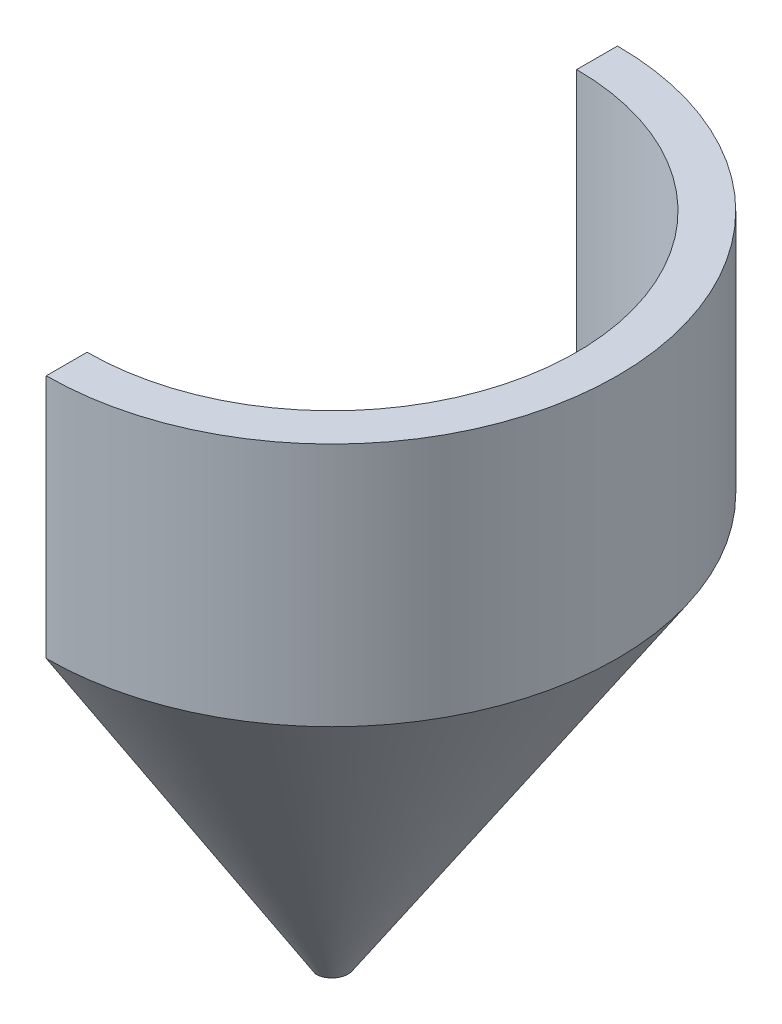
ISO-10303-21;
HEADER;
FILE_DESCRIPTION(('STEP AP214'),'2;1');
FILE_NAME('part.step','',(''),(''),'','','');
FILE_SCHEMA(('AUTOMOTIVE_DESIGN { 1 0 10303 214 1 1 1 1 }'));
ENDSEC;
DATA;
#1=APPLICATION_CONTEXT('core data for automotive mechanical design processes');
#2=APPLICATION_PROTOCOL_DEFINITION('international standard','automotive_design',2000,#1);
#3=PRODUCT_CONTEXT('',#1,'mechanical');
#4=PRODUCT('Part','Part','',(#3));
#5=PRODUCT_RELATED_PRODUCT_CATEGORY('part','',(#4));
#6=PRODUCT_DEFINITION_FORMATION('','',#4);
#7=PRODUCT_DEFINITION_CONTEXT('part definition',#1,'design');
#8=PRODUCT_DEFINITION('design','',#6,#7);
#9=PRODUCT_DEFINITION_SHAPE('','',#8);
#10=(LENGTH_UNIT() NAMED_UNIT(*) SI_UNIT(.MILLI.,.METRE.));
#11=(NAMED_UNIT(*) PLANE_ANGLE_UNIT() SI_UNIT($,.RADIAN.));
#12=(NAMED_UNIT(*) SI_UNIT($,.STERADIAN.) SOLID_ANGLE_UNIT());
#13=UNCERTAINTY_MEASURE_WITH_UNIT(LENGTH_MEASURE(1.E-05),#10,'distance_accuracy_value','');
#14=(GEOMETRIC_REPRESENTATION_CONTEXT(3) GLOBAL_UNCERTAINTY_ASSIGNED_CONTEXT((#13)) GLOBAL_UNIT_ASSIGNED_CONTEXT((#10,
#11,#12)) REPRESENTATION_CONTEXT('',''));
#15=CARTESIAN_POINT('',(0.,0.,0.));
#16=DIRECTION('',(0.,0.,1.));
#17=DIRECTION('',(1.,0.,0.));
#18=AXIS2_PLACEMENT_3D('',#15,#16,#17);
#19=CARTESIAN_POINT('',(0.,0.,0.));
#20=DIRECTION('',(1.,0.,0.));
#21=DIRECTION('',(0.,0.,-1.));
#22=AXIS2_PLACEMENT_3D('',#19,#20,#21);
#23=PLANE('',#22);
#24=DIRECTION('',(0.,-1.,0.));
#25=VECTOR('',#24,1.);
#26=CARTESIAN_POINT('',(0.,30.,-30.));
#27=LINE('',#26,#25);
#28=CARTESIAN_POINT('',(0.,0.,-30.));
#29=VERTEX_POINT('',#28);
#30=CARTESIAN_POINT('',(0.,30.,-30.));
#31=VERTEX_POINT('',#30);
#32=EDGE_CURVE('E11',#29,#31,#27,.F.);
#33=ORIENTED_EDGE('',*,*,#32,.T.);
#34=DIRECTION('',(0.,0.,-1.));
#35=VECTOR('',#34,1.);
#36=CARTESIAN_POINT('',(0.,30.,0.));
#37=LINE('',#36,#35);
#38=CARTESIAN_POINT('',(0.,30.,-35.));
#39=VERTEX_POINT('',#38);
#40=EDGE_CURVE('E65',#31,#39,#37,.T.);
#41=ORIENTED_EDGE('',*,*,#40,.T.);
#42=DIRECTION('',(0.,-1.,0.));
#43=VECTOR('',#42,1.);
#44=CARTESIAN_POINT('',(0.,30.,-35.));
#45=LINE('',#44,#43);
#46=CARTESIAN_POINT('',(0.,0.,-35.));
#47=VERTEX_POINT('',#46);
#48=EDGE_CURVE('E107',#47,#39,#45,.F.);
#49=ORIENTED_EDGE('',*,*,#48,.F.);
#50=DIRECTION('',(0.,0.834609406561725,-0.550842208330739));
#51=VECTOR('',#50,1.);
#52=CARTESIAN_POINT('',(0.,-53.030303030303,0.));
#53=LINE('',#52,#51);
#54=CARTESIAN_POINT('',(0.,-50.,-2.));
#55=VERTEX_POINT('',#54);
#56=EDGE_CURVE('E116',#55,#47,#53,.T.);
#57=ORIENTED_EDGE('',*,*,#56,.F.);
#58=DIRECTION('',(0.,0.,-1.));
#59=VECTOR('',#58,1.);
#60=CARTESIAN_POINT('',(0.,-50.,0.));
#61=LINE('',#60,#59);
#62=CARTESIAN_POINT('',(0.,-50.,2.));
#63=VERTEX_POINT('',#62);
#64=EDGE_CURVE('E112',#63,#55,#61,.T.);
#65=ORIENTED_EDGE('',*,*,#64,.F.);
#66=DIRECTION('',(0.,-0.834609406561725,-0.550842208330739));
#67=VECTOR('',#66,1.);
#68=CARTESIAN_POINT('',(0.,-53.030303030303,0.));
#69=LINE('',#68,#67);
#70=CARTESIAN_POINT('',(0.,0.,35.));
#71=VERTEX_POINT('',#70);
#72=EDGE_CURVE('E110',#71,#63,#69,.T.);
#73=ORIENTED_EDGE('',*,*,#72,.F.);
#74=DIRECTION('',(0.,-1.,0.));
#75=VECTOR('',#74,1.);
#76=CARTESIAN_POINT('',(0.,30.,35.));
#77=LINE('',#76,#75);
#78=CARTESIAN_POINT('',(0.,30.,35.));
#79=VERTEX_POINT('',#78);
#80=EDGE_CURVE('E99',#79,#71,#77,.T.);
#81=ORIENTED_EDGE('',*,*,#80,.F.);
#82=CARTESIAN_POINT('',(0.,30.,30.));
#83=VERTEX_POINT('',#82);
#84=EDGE_CURVE('E106',#79,#83,#37,.T.);
#85=ORIENTED_EDGE('',*,*,#84,.T.);
#86=DIRECTION('',(0.,-1.,0.));
#87=VECTOR('',#86,1.);
#88=CARTESIAN_POINT('',(0.,30.,30.));
#89=LINE('',#88,#87);
#90=CARTESIAN_POINT('',(0.,0.,30.));
#91=VERTEX_POINT('',#90);
#92=EDGE_CURVE('E51',#83,#91,#89,.T.);
#93=ORIENTED_EDGE('',*,*,#92,.T.);
#94=DIRECTION('',(0.,-0.849056603773585,-0.528301886792453));
#95=VECTOR('',#94,1.);
#96=CARTESIAN_POINT('',(0.,-48.2142857142857,0.));
#97=LINE('',#96,#95);
#98=CARTESIAN_POINT('',(0.,-45.,2.));
#99=VERTEX_POINT('',#98);
#100=EDGE_CURVE('E134',#99,#91,#97,.F.);
#101=ORIENTED_EDGE('',*,*,#100,.F.);
#102=DIRECTION('',(0.,0.,1.));
#103=VECTOR('',#102,1.);
#104=CARTESIAN_POINT('',(0.,-45.,0.));
#105=LINE('',#104,#103);
#106=CARTESIAN_POINT('',(0.,-45.,-2.));
#107=VERTEX_POINT('',#106);
#108=EDGE_CURVE('E139',#107,#99,#105,.T.);
#109=ORIENTED_EDGE('',*,*,#108,.F.);
#110=DIRECTION('',(0.,0.849056603773585,-0.528301886792453));
#111=VECTOR('',#110,1.);
#112=CARTESIAN_POINT('',(0.,-48.2142857142857,0.));
#113=LINE('',#112,#111);
#114=EDGE_CURVE('E46',#29,#107,#113,.F.);
#115=ORIENTED_EDGE('',*,*,#114,.F.);
#116=EDGE_LOOP('',(#33,#41,#49,#57,#65,#73,#81,#85,#93,#101,#109,#115));
#117=FACE_BOUND('',#116,.T.);
#118=ADVANCED_FACE('F43',(#117),#23,.F.);
#119=CARTESIAN_POINT('',(0.,30.,0.));
#120=DIRECTION('',(0.,1.,0.));
#121=DIRECTION('',(0.,0.,1.));
#122=AXIS2_PLACEMENT_3D('',#119,#120,#121);
#123=PLANE('',#122);
#124=ORIENTED_EDGE('',*,*,#84,.F.);
#125=CARTESIAN_POINT('',(0.,30.,0.));
#126=DIRECTION('',(0.,1.,0.));
#127=DIRECTION('',(0.,0.,1.));
#128=AXIS2_PLACEMENT_3D('',#125,#126,#127);
#129=CIRCLE('',#128,35.);
#130=EDGE_CURVE('E104',#79,#39,#129,.T.);
#131=ORIENTED_EDGE('',*,*,#130,.T.);
#132=ORIENTED_EDGE('',*,*,#40,.F.);
#133=CARTESIAN_POINT('',(0.,30.,0.));
#134=DIRECTION('',(0.,1.,0.));
#135=DIRECTION('',(0.,0.,1.));
#136=AXIS2_PLACEMENT_3D('',#133,#134,#135);
#137=CIRCLE('',#136,30.);
#138=EDGE_CURVE('E128',#83,#31,#137,.T.);
#139=ORIENTED_EDGE('',*,*,#138,.F.);
#140=EDGE_LOOP('',(#124,#131,#132,#139));
#141=FACE_BOUND('',#140,.T.);
#142=ADVANCED_FACE('F151',(#141),#123,.T.);
#143=CARTESIAN_POINT('',(0.,-45.,0.));
#144=DIRECTION('',(0.,-1.,0.));
#145=DIRECTION('',(1.,0.,0.));
#146=AXIS2_PLACEMENT_3D('',#143,#144,#145);
#147=PLANE('',#146);
#148=CARTESIAN_POINT('',(0.,-45.,0.));
#149=DIRECTION('',(0.,1.,0.));
#150=DIRECTION('',(-1.,0.,0.));
#151=AXIS2_PLACEMENT_3D('',#148,#149,#150);
#152=CIRCLE('',#151,2.);
#153=EDGE_CURVE('E120',#99,#107,#152,.T.);
#154=ORIENTED_EDGE('',*,*,#153,.T.);
#155=ORIENTED_EDGE('',*,*,#108,.T.);
#156=EDGE_LOOP('',(#154,#155));
#157=FACE_BOUND('',#156,.T.);
#158=ADVANCED_FACE('F148',(#157),#147,.F.);
#159=CARTESIAN_POINT('',(0.,30.,0.));
#160=DIRECTION('',(0.,-1.,0.));
#161=DIRECTION('',(0.,0.,-1.));
#162=AXIS2_PLACEMENT_3D('',#159,#160,#161);
#163=CYLINDRICAL_SURFACE('',#162,30.);
#164=ORIENTED_EDGE('',*,*,#92,.F.);
#165=ORIENTED_EDGE('',*,*,#138,.T.);
#166=ORIENTED_EDGE('',*,*,#32,.F.);
#167=CARTESIAN_POINT('',(0.,0.,0.));
#168=DIRECTION('',(0.,1.,0.));
#169=DIRECTION('',(0.,0.,1.));
#170=AXIS2_PLACEMENT_3D('',#167,#168,#169);
#171=CIRCLE('',#170,30.);
#172=EDGE_CURVE('E124',#91,#29,#171,.T.);
#173=ORIENTED_EDGE('',*,*,#172,.F.);
#174=EDGE_LOOP('',(#164,#165,#166,#173));
#175=FACE_BOUND('',#174,.T.);
#176=ADVANCED_FACE('F150',(#175),#163,.F.);
#177=CARTESIAN_POINT('',(0.,0.,0.));
#178=DIRECTION('',(0.,1.,0.));
#179=DIRECTION('',(-1.,0.,0.));
#180=AXIS2_PLACEMENT_3D('',#177,#178,#179);
#181=CONICAL_SURFACE('',#180,30.,0.556599318010223);
#182=ORIENTED_EDGE('',*,*,#172,.T.);
#183=ORIENTED_EDGE('',*,*,#114,.T.);
#184=ORIENTED_EDGE('',*,*,#153,.F.);
#185=ORIENTED_EDGE('',*,*,#100,.T.);
#186=EDGE_LOOP('',(#182,#183,#184,#185));
#187=FACE_BOUND('',#186,.T.);
#188=ADVANCED_FACE('F146',(#187),#181,.F.);
#189=CARTESIAN_POINT('',(0.,30.,0.));
#190=DIRECTION('',(0.,-1.,0.));
#191=DIRECTION('',(0.,0.,-1.));
#192=AXIS2_PLACEMENT_3D('',#189,#190,#191);
#193=CYLINDRICAL_SURFACE('',#192,35.);
#194=ORIENTED_EDGE('',*,*,#130,.F.);
#195=ORIENTED_EDGE('',*,*,#80,.T.);
#196=CARTESIAN_POINT('',(0.,0.,0.));
#197=DIRECTION('',(0.,1.,0.));
#198=DIRECTION('',(-1.,0.,0.));
#199=AXIS2_PLACEMENT_3D('',#196,#197,#198);
#200=CIRCLE('',#199,35.);
#201=EDGE_CURVE('E103',#71,#47,#200,.T.);
#202=ORIENTED_EDGE('',*,*,#201,.T.);
#203=ORIENTED_EDGE('',*,*,#48,.T.);
#204=EDGE_LOOP('',(#194,#195,#202,#203));
#205=FACE_BOUND('',#204,.T.);
#206=ADVANCED_FACE('F101',(#205),#193,.T.);
#207=CARTESIAN_POINT('',(2.00000000000001,-50.,0.));
#208=DIRECTION('',(0.,1.,0.));
#209=DIRECTION('',(-1.,0.,0.));
#210=AXIS2_PLACEMENT_3D('',#207,#208,#209);
#211=PLANE('',#210);
#212=CARTESIAN_POINT('',(0.,-50.,0.));
#213=DIRECTION('',(0.,1.,0.));
#214=DIRECTION('',(-1.,0.,0.));
#215=AXIS2_PLACEMENT_3D('',#212,#213,#214);
#216=CIRCLE('',#215,2.);
#217=EDGE_CURVE('E121',#63,#55,#216,.T.);
#218=ORIENTED_EDGE('',*,*,#217,.F.);
#219=ORIENTED_EDGE('',*,*,#64,.T.);
#220=EDGE_LOOP('',(#218,#219));
#221=FACE_BOUND('',#220,.T.);
#222=ADVANCED_FACE('F165',(#221),#211,.F.);
#223=CARTESIAN_POINT('',(0.,-50.,0.));
#224=DIRECTION('',(0.,1.,0.));
#225=DIRECTION('',(-1.,0.,0.));
#226=AXIS2_PLACEMENT_3D('',#223,#224,#225);
#227=CONICAL_SURFACE('',#226,2.,0.583373006993856);
#228=ORIENTED_EDGE('',*,*,#217,.T.);
#229=ORIENTED_EDGE('',*,*,#56,.T.);
#230=ORIENTED_EDGE('',*,*,#201,.F.);
#231=ORIENTED_EDGE('',*,*,#72,.T.);
#232=EDGE_LOOP('',(#228,#229,#230,#231));
#233=FACE_BOUND('',#232,.T.);
#234=ADVANCED_FACE('F118',(#233),#227,.T.);
#235=CLOSED_SHELL('',(#118,#142,#158,#176,#188,#206,#222,#234));
#236=MANIFOLD_SOLID_BREP('B2',#235);
#237=ADVANCED_BREP_SHAPE_REPRESENTATION('',(#18,#236),#14);
#238=SHAPE_DEFINITION_REPRESENTATION(#9,#237);
ENDSEC;
END-ISO-10303-21;
